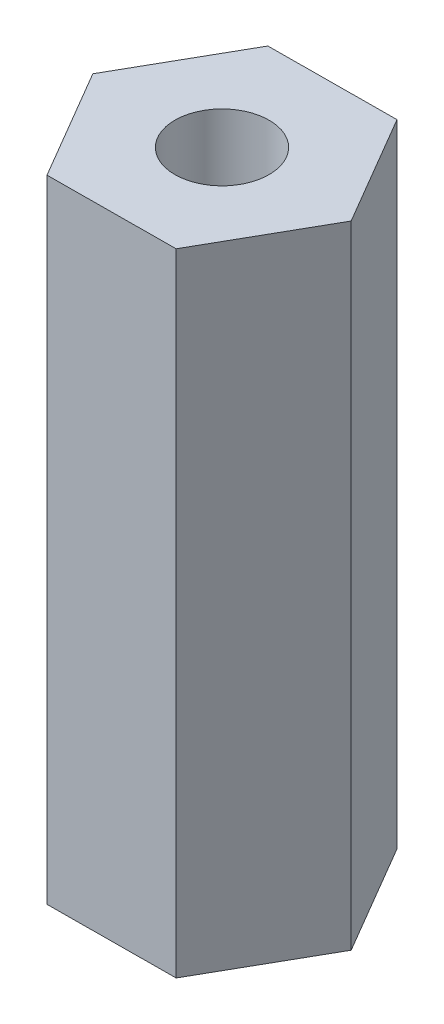
ISO-10303-21;
HEADER;
FILE_DESCRIPTION(('STEP AP214'),'2;1');
FILE_NAME('part.step','',(''),(''),'','','');
FILE_SCHEMA(('AUTOMOTIVE_DESIGN { 1 0 10303 214 1 1 1 1 }'));
ENDSEC;
DATA;
#1=APPLICATION_CONTEXT('core data for automotive mechanical design processes');
#2=APPLICATION_PROTOCOL_DEFINITION('international standard','automotive_design',2000,#1);
#3=PRODUCT_CONTEXT('',#1,'mechanical');
#4=PRODUCT('Part','Part','',(#3));
#5=PRODUCT_RELATED_PRODUCT_CATEGORY('part','',(#4));
#6=PRODUCT_DEFINITION_FORMATION('','',#4);
#7=PRODUCT_DEFINITION_CONTEXT('part definition',#1,'design');
#8=PRODUCT_DEFINITION('design','',#6,#7);
#9=PRODUCT_DEFINITION_SHAPE('','',#8);
#10=(LENGTH_UNIT() NAMED_UNIT(*) SI_UNIT(.MILLI.,.METRE.));
#11=(NAMED_UNIT(*) PLANE_ANGLE_UNIT() SI_UNIT($,.RADIAN.));
#12=(NAMED_UNIT(*) SI_UNIT($,.STERADIAN.) SOLID_ANGLE_UNIT());
#13=UNCERTAINTY_MEASURE_WITH_UNIT(LENGTH_MEASURE(1.E-05),#10,'distance_accuracy_value','');
#14=(GEOMETRIC_REPRESENTATION_CONTEXT(3) GLOBAL_UNCERTAINTY_ASSIGNED_CONTEXT((#13)) GLOBAL_UNIT_ASSIGNED_CONTEXT((#10,
#11,#12)) REPRESENTATION_CONTEXT('',''));
#15=CARTESIAN_POINT('',(0.,0.,0.));
#16=DIRECTION('',(0.,0.,1.));
#17=DIRECTION('',(1.,0.,0.));
#18=AXIS2_PLACEMENT_3D('',#15,#16,#17);
#19=CARTESIAN_POINT('',(0.,28.41,0.));
#20=DIRECTION('',(0.,1.,0.));
#21=DIRECTION('',(0.,0.,1.));
#22=AXIS2_PLACEMENT_3D('',#19,#20,#21);
#23=PLANE('',#22);
#24=DIRECTION('',(0.999979578554637,0.,-0.0063908116613552));
#25=VECTOR('',#24,1.);
#26=CARTESIAN_POINT('',(-2.85473833600646,28.41,5.0183465769383));
#27=LINE('',#26,#25);
#28=CARTESIAN_POINT('',(-2.85473833600646,28.41,5.0183465769383));
#29=VERTEX_POINT('',#28);
#30=CARTESIAN_POINT('',(2.91864645262001,28.41,4.98144920860807));
#31=VERTEX_POINT('',#30);
#32=EDGE_CURVE('E128',#29,#31,#27,.T.);
#33=ORIENTED_EDGE('',*,*,#32,.T.);
#34=DIRECTION('',(0.494455184027783,0.,-0.86920312412465));
#35=VECTOR('',#34,1.);
#36=CARTESIAN_POINT('',(2.91864645262001,28.41,4.98144920860807));
#37=LINE('',#36,#35);
#38=CARTESIAN_POINT('',(5.77338478862648,28.41,-0.0368973683302362));
#39=VERTEX_POINT('',#38);
#40=EDGE_CURVE('E86',#31,#39,#37,.T.);
#41=ORIENTED_EDGE('',*,*,#40,.T.);
#42=DIRECTION('',(-0.505524394526854,0.,-0.862812312463295));
#43=VECTOR('',#42,1.);
#44=CARTESIAN_POINT('',(5.77338478862648,28.41,-0.0368973683302362));
#45=LINE('',#44,#43);
#46=CARTESIAN_POINT('',(2.85473833600646,28.41,-5.0183465769383));
#47=VERTEX_POINT('',#46);
#48=EDGE_CURVE('E99',#39,#47,#45,.T.);
#49=ORIENTED_EDGE('',*,*,#48,.T.);
#50=DIRECTION('',(-0.999979578554637,0.,0.0063908116613549));
#51=VECTOR('',#50,1.);
#52=CARTESIAN_POINT('',(2.85473833600646,28.41,-5.0183465769383));
#53=LINE('',#52,#51);
#54=CARTESIAN_POINT('',(-2.91864645262001,28.41,-4.98144920860807));
#55=VERTEX_POINT('',#54);
#56=EDGE_CURVE('E93',#47,#55,#53,.T.);
#57=ORIENTED_EDGE('',*,*,#56,.T.);
#58=DIRECTION('',(-0.494455184027783,0.,0.86920312412465));
#59=VECTOR('',#58,1.);
#60=CARTESIAN_POINT('',(-2.91864645262001,28.41,-4.98144920860807));
#61=LINE('',#60,#59);
#62=CARTESIAN_POINT('',(-5.77338478862648,28.41,0.0368973683302366));
#63=VERTEX_POINT('',#62);
#64=EDGE_CURVE('E97',#55,#63,#61,.T.);
#65=ORIENTED_EDGE('',*,*,#64,.T.);
#66=DIRECTION('',(0.505524394526854,0.,0.862812312463295));
#67=VECTOR('',#66,1.);
#68=CARTESIAN_POINT('',(-5.77338478862648,28.41,0.0368973683302366));
#69=LINE('',#68,#67);
#70=EDGE_CURVE('E49',#63,#29,#69,.T.);
#71=ORIENTED_EDGE('',*,*,#70,.T.);
#72=EDGE_LOOP('',(#33,#41,#49,#57,#65,#71));
#73=FACE_BOUND('',#72,.T.);
#74=CARTESIAN_POINT('',(0.,28.41,0.));
#75=DIRECTION('',(0.,1.,0.));
#76=DIRECTION('',(0.,0.,1.));
#77=AXIS2_PLACEMENT_3D('',#74,#75,#76);
#78=CIRCLE('',#77,2.1209);
#79=CARTESIAN_POINT('',(0.,28.41,2.1209));
#80=VERTEX_POINT('',#79);
#81=EDGE_CURVE('E121',#80,#80,#78,.T.);
#82=ORIENTED_EDGE('',*,*,#81,.F.);
#83=EDGE_LOOP('',(#82));
#84=FACE_BOUND('',#83,.T.);
#85=ADVANCED_FACE('F32',(#73,#84),#23,.T.);
#86=CARTESIAN_POINT('',(0.,0.,0.));
#87=DIRECTION('',(0.,1.,0.));
#88=DIRECTION('',(0.,0.,1.));
#89=AXIS2_PLACEMENT_3D('',#86,#87,#88);
#90=PLANE('',#89);
#91=DIRECTION('',(0.999979578554637,0.,-0.0063908116613552));
#92=VECTOR('',#91,1.);
#93=CARTESIAN_POINT('',(-2.85473833600646,0.,5.0183465769383));
#94=LINE('',#93,#92);
#95=CARTESIAN_POINT('',(-2.85473833600646,0.,5.0183465769383));
#96=VERTEX_POINT('',#95);
#97=CARTESIAN_POINT('',(2.91864645262001,0.,4.98144920860807));
#98=VERTEX_POINT('',#97);
#99=EDGE_CURVE('E117',#96,#98,#94,.T.);
#100=ORIENTED_EDGE('',*,*,#99,.F.);
#101=DIRECTION('',(0.505524394526854,0.,0.862812312463295));
#102=VECTOR('',#101,1.);
#103=CARTESIAN_POINT('',(-5.77338478862648,0.,0.0368973683302366));
#104=LINE('',#103,#102);
#105=CARTESIAN_POINT('',(-5.77338478862648,0.,0.0368973683302366));
#106=VERTEX_POINT('',#105);
#107=EDGE_CURVE('E78',#106,#96,#104,.T.);
#108=ORIENTED_EDGE('',*,*,#107,.F.);
#109=DIRECTION('',(-0.494455184027783,0.,0.86920312412465));
#110=VECTOR('',#109,1.);
#111=CARTESIAN_POINT('',(-2.91864645262001,0.,-4.98144920860807));
#112=LINE('',#111,#110);
#113=CARTESIAN_POINT('',(-2.91864645262001,0.,-4.98144920860807));
#114=VERTEX_POINT('',#113);
#115=EDGE_CURVE('E72',#114,#106,#112,.T.);
#116=ORIENTED_EDGE('',*,*,#115,.F.);
#117=DIRECTION('',(-0.999979578554637,0.,0.0063908116613549));
#118=VECTOR('',#117,1.);
#119=CARTESIAN_POINT('',(2.85473833600646,0.,-5.0183465769383));
#120=LINE('',#119,#118);
#121=CARTESIAN_POINT('',(2.85473833600646,0.,-5.0183465769383));
#122=VERTEX_POINT('',#121);
#123=EDGE_CURVE('E107',#122,#114,#120,.T.);
#124=ORIENTED_EDGE('',*,*,#123,.F.);
#125=DIRECTION('',(-0.505524394526854,0.,-0.862812312463295));
#126=VECTOR('',#125,1.);
#127=CARTESIAN_POINT('',(5.77338478862648,0.,-0.0368973683302362));
#128=LINE('',#127,#126);
#129=CARTESIAN_POINT('',(5.77338478862648,0.,-0.0368973683302362));
#130=VERTEX_POINT('',#129);
#131=EDGE_CURVE('E123',#130,#122,#128,.T.);
#132=ORIENTED_EDGE('',*,*,#131,.F.);
#133=DIRECTION('',(0.494455184027783,0.,-0.86920312412465));
#134=VECTOR('',#133,1.);
#135=CARTESIAN_POINT('',(2.91864645262001,0.,4.98144920860807));
#136=LINE('',#135,#134);
#137=EDGE_CURVE('E120',#98,#130,#136,.T.);
#138=ORIENTED_EDGE('',*,*,#137,.F.);
#139=EDGE_LOOP('',(#100,#108,#116,#124,#132,#138));
#140=FACE_BOUND('',#139,.T.);
#141=CARTESIAN_POINT('',(0.,0.,0.));
#142=DIRECTION('',(0.,1.,0.));
#143=DIRECTION('',(0.,0.,1.));
#144=AXIS2_PLACEMENT_3D('',#141,#142,#143);
#145=CIRCLE('',#144,2.1209);
#146=CARTESIAN_POINT('',(0.,0.,2.1209));
#147=VERTEX_POINT('',#146);
#148=EDGE_CURVE('E221',#147,#147,#145,.T.);
#149=ORIENTED_EDGE('',*,*,#148,.T.);
#150=EDGE_LOOP('',(#149));
#151=FACE_BOUND('',#150,.T.);
#152=ADVANCED_FACE('F137',(#140,#151),#90,.F.);
#153=CARTESIAN_POINT('',(-2.85473833600646,28.41,5.0183465769383));
#154=DIRECTION('',(-0.00639081166135521,0.,-0.999979578554637));
#155=DIRECTION('',(-0.999979578554637,0.,0.00639081166135521));
#156=AXIS2_PLACEMENT_3D('',#153,#154,#155);
#157=PLANE('',#156);
#158=ORIENTED_EDGE('',*,*,#99,.T.);
#159=DIRECTION('',(0.,-1.,0.));
#160=VECTOR('',#159,1.);
#161=CARTESIAN_POINT('',(2.91864645262001,28.41,4.98144920860807));
#162=LINE('',#161,#160);
#163=EDGE_CURVE('E11',#31,#98,#162,.T.);
#164=ORIENTED_EDGE('',*,*,#163,.F.);
#165=ORIENTED_EDGE('',*,*,#32,.F.);
#166=DIRECTION('',(0.,-1.,0.));
#167=VECTOR('',#166,1.);
#168=CARTESIAN_POINT('',(-2.85473833600646,28.41,5.0183465769383));
#169=LINE('',#168,#167);
#170=EDGE_CURVE('E113',#29,#96,#169,.T.);
#171=ORIENTED_EDGE('',*,*,#170,.T.);
#172=EDGE_LOOP('',(#158,#164,#165,#171));
#173=FACE_BOUND('',#172,.T.);
#174=ADVANCED_FACE('F34',(#173),#157,.F.);
#175=CARTESIAN_POINT('',(2.91864645262001,28.41,4.98144920860807));
#176=DIRECTION('',(-0.86920312412465,0.,-0.494455184027783));
#177=DIRECTION('',(-0.494455184027783,0.,0.86920312412465));
#178=AXIS2_PLACEMENT_3D('',#175,#176,#177);
#179=PLANE('',#178);
#180=ORIENTED_EDGE('',*,*,#137,.T.);
#181=DIRECTION('',(0.,-1.,0.));
#182=VECTOR('',#181,1.);
#183=CARTESIAN_POINT('',(5.77338478862648,28.41,-0.0368973683302362));
#184=LINE('',#183,#182);
#185=EDGE_CURVE('E41',#39,#130,#184,.T.);
#186=ORIENTED_EDGE('',*,*,#185,.F.);
#187=ORIENTED_EDGE('',*,*,#40,.F.);
#188=ORIENTED_EDGE('',*,*,#163,.T.);
#189=EDGE_LOOP('',(#180,#186,#187,#188));
#190=FACE_BOUND('',#189,.T.);
#191=ADVANCED_FACE('F162',(#190),#179,.F.);
#192=CARTESIAN_POINT('',(5.77338478862648,28.41,-0.0368973683302362));
#193=DIRECTION('',(-0.862812312463294,0.,0.505524394526854));
#194=DIRECTION('',(0.505524394526854,0.,0.862812312463295));
#195=AXIS2_PLACEMENT_3D('',#192,#193,#194);
#196=PLANE('',#195);
#197=ORIENTED_EDGE('',*,*,#131,.T.);
#198=DIRECTION('',(0.,-1.,0.));
#199=VECTOR('',#198,1.);
#200=CARTESIAN_POINT('',(2.85473833600646,28.41,-5.0183465769383));
#201=LINE('',#200,#199);
#202=EDGE_CURVE('E108',#47,#122,#201,.T.);
#203=ORIENTED_EDGE('',*,*,#202,.F.);
#204=ORIENTED_EDGE('',*,*,#48,.F.);
#205=ORIENTED_EDGE('',*,*,#185,.T.);
#206=EDGE_LOOP('',(#197,#203,#204,#205));
#207=FACE_BOUND('',#206,.T.);
#208=ADVANCED_FACE('F134',(#207),#196,.F.);
#209=CARTESIAN_POINT('',(2.85473833600646,28.41,-5.0183465769383));
#210=DIRECTION('',(0.0063908116613549,0.,0.999979578554637));
#211=DIRECTION('',(0.999979578554637,0.,-0.0063908116613549));
#212=AXIS2_PLACEMENT_3D('',#209,#210,#211);
#213=PLANE('',#212);
#214=ORIENTED_EDGE('',*,*,#123,.T.);
#215=DIRECTION('',(0.,-1.,0.));
#216=VECTOR('',#215,1.);
#217=CARTESIAN_POINT('',(-2.91864645262001,28.41,-4.98144920860807));
#218=LINE('',#217,#216);
#219=EDGE_CURVE('E104',#55,#114,#218,.T.);
#220=ORIENTED_EDGE('',*,*,#219,.F.);
#221=ORIENTED_EDGE('',*,*,#56,.F.);
#222=ORIENTED_EDGE('',*,*,#202,.T.);
#223=EDGE_LOOP('',(#214,#220,#221,#222));
#224=FACE_BOUND('',#223,.T.);
#225=ADVANCED_FACE('F105',(#224),#213,.F.);
#226=CARTESIAN_POINT('',(-2.91864645262001,28.41,-4.98144920860807));
#227=DIRECTION('',(0.86920312412465,0.,0.494455184027783));
#228=DIRECTION('',(0.494455184027783,0.,-0.86920312412465));
#229=AXIS2_PLACEMENT_3D('',#226,#227,#228);
#230=PLANE('',#229);
#231=ORIENTED_EDGE('',*,*,#115,.T.);
#232=DIRECTION('',(0.,-1.,0.));
#233=VECTOR('',#232,1.);
#234=CARTESIAN_POINT('',(-5.77338478862648,28.41,0.0368973683302366));
#235=LINE('',#234,#233);
#236=EDGE_CURVE('E109',#63,#106,#235,.T.);
#237=ORIENTED_EDGE('',*,*,#236,.F.);
#238=ORIENTED_EDGE('',*,*,#64,.F.);
#239=ORIENTED_EDGE('',*,*,#219,.T.);
#240=EDGE_LOOP('',(#231,#237,#238,#239));
#241=FACE_BOUND('',#240,.T.);
#242=ADVANCED_FACE('F111',(#241),#230,.F.);
#243=CARTESIAN_POINT('',(-5.77338478862648,28.41,0.0368973683302366));
#244=DIRECTION('',(0.862812312463295,0.,-0.505524394526854));
#245=DIRECTION('',(-0.505524394526854,0.,-0.862812312463295));
#246=AXIS2_PLACEMENT_3D('',#243,#244,#245);
#247=PLANE('',#246);
#248=ORIENTED_EDGE('',*,*,#107,.T.);
#249=ORIENTED_EDGE('',*,*,#170,.F.);
#250=ORIENTED_EDGE('',*,*,#70,.F.);
#251=ORIENTED_EDGE('',*,*,#236,.T.);
#252=EDGE_LOOP('',(#248,#249,#250,#251));
#253=FACE_BOUND('',#252,.T.);
#254=ADVANCED_FACE('F142',(#253),#247,.F.);
#255=CARTESIAN_POINT('',(0.,28.41,0.));
#256=DIRECTION('',(0.,-1.,0.));
#257=DIRECTION('',(0.,0.,-1.));
#258=AXIS2_PLACEMENT_3D('',#255,#256,#257);
#259=CYLINDRICAL_SURFACE('',#258,2.1209);
#260=ORIENTED_EDGE('',*,*,#81,.T.);
#261=EDGE_LOOP('',(#260));
#262=FACE_BOUND('',#261,.T.);
#263=ORIENTED_EDGE('',*,*,#148,.F.);
#264=EDGE_LOOP('',(#263));
#265=FACE_BOUND('',#264,.T.);
#266=ADVANCED_FACE('F144',(#262,#265),#259,.F.);
#267=CLOSED_SHELL('',(#85,#152,#174,#191,#208,#225,#242,#254,#266));
#268=MANIFOLD_SOLID_BREP('B2',#267);
#269=ADVANCED_BREP_SHAPE_REPRESENTATION('',(#18,#268),#14);
#270=SHAPE_DEFINITION_REPRESENTATION(#9,#269);
ENDSEC;
END-ISO-10303-21;
